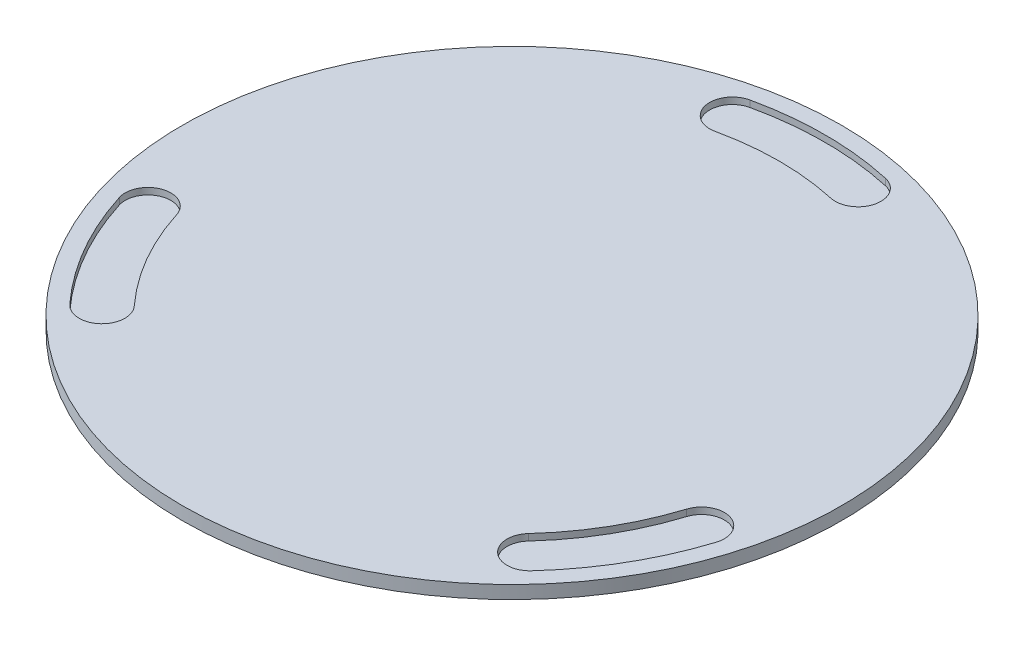
ISO-10303-21;
HEADER;
FILE_DESCRIPTION(('STEP AP214'),'2;1');
FILE_NAME('part.step','',(''),(''),'','','');
FILE_SCHEMA(('AUTOMOTIVE_DESIGN { 1 0 10303 214 1 1 1 1 }'));
ENDSEC;
DATA;
#1=APPLICATION_CONTEXT('core data for automotive mechanical design processes');
#2=APPLICATION_PROTOCOL_DEFINITION('international standard','automotive_design',2000,#1);
#3=PRODUCT_CONTEXT('',#1,'mechanical');
#4=PRODUCT('Part','Part','',(#3));
#5=PRODUCT_RELATED_PRODUCT_CATEGORY('part','',(#4));
#6=PRODUCT_DEFINITION_FORMATION('','',#4);
#7=PRODUCT_DEFINITION_CONTEXT('part definition',#1,'design');
#8=PRODUCT_DEFINITION('design','',#6,#7);
#9=PRODUCT_DEFINITION_SHAPE('','',#8);
#10=(LENGTH_UNIT() NAMED_UNIT(*) SI_UNIT(.MILLI.,.METRE.));
#11=(NAMED_UNIT(*) PLANE_ANGLE_UNIT() SI_UNIT($,.RADIAN.));
#12=(NAMED_UNIT(*) SI_UNIT($,.STERADIAN.) SOLID_ANGLE_UNIT());
#13=UNCERTAINTY_MEASURE_WITH_UNIT(LENGTH_MEASURE(1.E-05),#10,'distance_accuracy_value','');
#14=(GEOMETRIC_REPRESENTATION_CONTEXT(3) GLOBAL_UNCERTAINTY_ASSIGNED_CONTEXT((#13)) GLOBAL_UNIT_ASSIGNED_CONTEXT((#10,
#11,#12)) REPRESENTATION_CONTEXT('',''));
#15=CARTESIAN_POINT('',(0.,0.,0.));
#16=DIRECTION('',(0.,0.,1.));
#17=DIRECTION('',(1.,0.,0.));
#18=AXIS2_PLACEMENT_3D('',#15,#16,#17);
#19=CARTESIAN_POINT('',(0.,1.,0.));
#20=DIRECTION('',(0.,-1.,0.));
#21=DIRECTION('',(0.,0.,-1.));
#22=AXIS2_PLACEMENT_3D('',#19,#20,#21);
#23=CYLINDRICAL_SURFACE('',#22,50.5);
#24=CARTESIAN_POINT('',(0.,1.,0.));
#25=DIRECTION('',(0.,1.,0.));
#26=DIRECTION('',(0.,0.,1.));
#27=AXIS2_PLACEMENT_3D('',#24,#25,#26);
#28=CIRCLE('',#27,50.5);
#29=CARTESIAN_POINT('',(0.,1.,50.5));
#30=VERTEX_POINT('',#29);
#31=EDGE_CURVE('E11',#30,#30,#28,.T.);
#32=ORIENTED_EDGE('',*,*,#31,.F.);
#33=EDGE_LOOP('',(#32));
#34=FACE_BOUND('',#33,.T.);
#35=CARTESIAN_POINT('',(0.,-1.,0.));
#36=DIRECTION('',(0.,1.,0.));
#37=DIRECTION('',(0.,0.,1.));
#38=AXIS2_PLACEMENT_3D('',#35,#36,#37);
#39=CIRCLE('',#38,50.5);
#40=CARTESIAN_POINT('',(0.,-1.,50.5));
#41=VERTEX_POINT('',#40);
#42=EDGE_CURVE('E42',#41,#41,#39,.T.);
#43=ORIENTED_EDGE('',*,*,#42,.T.);
#44=EDGE_LOOP('',(#43));
#45=FACE_BOUND('',#44,.T.);
#46=ADVANCED_FACE('F39',(#34,#45),#23,.T.);
#47=CARTESIAN_POINT('',(0.,1.,0.));
#48=DIRECTION('',(0.,1.,0.));
#49=DIRECTION('',(0.,0.,1.));
#50=AXIS2_PLACEMENT_3D('',#47,#48,#49);
#51=PLANE('',#50);
#52=CARTESIAN_POINT('',(-42.4065150160027,1.,13.3707228251244));
#53=DIRECTION('',(0.,1.,0.));
#54=DIRECTION('',(0.866025403784436,0.,-0.500000000000004));
#55=AXIS2_PLACEMENT_3D('',#52,#53,#54);
#56=CIRCLE('',#55,3.5);
#57=CARTESIAN_POINT('',(-39.0685056883839,1.,12.3182525268594));
#58=VERTEX_POINT('',#57);
#59=CARTESIAN_POINT('',(-45.7445243436214,1.,14.4231931233894));
#60=VERTEX_POINT('',#59);
#61=EDGE_CURVE('E54',#58,#60,#56,.T.);
#62=ORIENTED_EDGE('',*,*,#61,.F.);
#63=CARTESIAN_POINT('',(0.,1.,0.));
#64=DIRECTION('',(0.,-1.,0.));
#65=DIRECTION('',(0.866025403784436,0.,-0.500000000000004));
#66=AXIS2_PLACEMENT_3D('',#63,#64,#65);
#67=CIRCLE('',#66,40.96446609);
#68=CARTESIAN_POINT('',(-30.2021724626838,1.,27.6751921506078));
#69=VERTEX_POINT('',#68);
#70=EDGE_CURVE('E151',#69,#58,#67,.T.);
#71=ORIENTED_EDGE('',*,*,#70,.F.);
#72=CARTESIAN_POINT('',(-32.7826431415192,1.,30.0397578772627));
#73=DIRECTION('',(0.,1.,0.));
#74=DIRECTION('',(0.866025403784436,0.,-0.500000000000004));
#75=AXIS2_PLACEMENT_3D('',#72,#73,#74);
#76=CIRCLE('',#75,3.5);
#77=CARTESIAN_POINT('',(-35.3631138203547,1.,32.4043236039175));
#78=VERTEX_POINT('',#77);
#79=EDGE_CURVE('E155',#78,#69,#76,.T.);
#80=ORIENTED_EDGE('',*,*,#79,.F.);
#81=CARTESIAN_POINT('',(0.,1.,0.));
#82=DIRECTION('',(0.,1.,0.));
#83=DIRECTION('',(0.866025403784436,0.,-0.500000000000004));
#84=AXIS2_PLACEMENT_3D('',#81,#82,#83);
#85=CIRCLE('',#84,47.96446609);
#86=EDGE_CURVE('E164',#60,#78,#85,.T.);
#87=ORIENTED_EDGE('',*,*,#86,.F.);
#88=EDGE_LOOP('',(#62,#71,#80,#87));
#89=FACE_BOUND('',#88,.T.);
#90=CARTESIAN_POINT('',(32.7826431415196,1.,30.0397578772622));
#91=DIRECTION('',(0.,1.,0.));
#92=DIRECTION('',(-0.866025403784443,0.,-0.499999999999992));
#93=AXIS2_PLACEMENT_3D('',#90,#91,#92);
#94=CIRCLE('',#93,3.5);
#95=CARTESIAN_POINT('',(30.2021724626842,1.,27.6751921506074));
#96=VERTEX_POINT('',#95);
#97=CARTESIAN_POINT('',(35.3631138203551,1.,32.404323603917));
#98=VERTEX_POINT('',#97);
#99=EDGE_CURVE('E62',#96,#98,#94,.T.);
#100=ORIENTED_EDGE('',*,*,#99,.F.);
#101=CARTESIAN_POINT('',(0.,1.,0.));
#102=DIRECTION('',(0.,-1.,0.));
#103=DIRECTION('',(-0.866025403784443,0.,-0.499999999999992));
#104=AXIS2_PLACEMENT_3D('',#101,#102,#103);
#105=CIRCLE('',#104,40.96446609);
#106=CARTESIAN_POINT('',(39.068505688384,1.,12.3182525268589));
#107=VERTEX_POINT('',#106);
#108=EDGE_CURVE('E185',#107,#96,#105,.T.);
#109=ORIENTED_EDGE('',*,*,#108,.F.);
#110=CARTESIAN_POINT('',(42.4065150160028,1.,13.3707228251238));
#111=DIRECTION('',(0.,1.,0.));
#112=DIRECTION('',(-0.866025403784443,0.,-0.499999999999992));
#113=AXIS2_PLACEMENT_3D('',#110,#111,#112);
#114=CIRCLE('',#113,3.5);
#115=CARTESIAN_POINT('',(45.7445243436216,1.,14.4231931233888));
#116=VERTEX_POINT('',#115);
#117=EDGE_CURVE('E204',#116,#107,#114,.T.);
#118=ORIENTED_EDGE('',*,*,#117,.F.);
#119=CARTESIAN_POINT('',(0.,1.,0.));
#120=DIRECTION('',(0.,1.,0.));
#121=DIRECTION('',(-0.866025403784443,0.,-0.499999999999992));
#122=AXIS2_PLACEMENT_3D('',#119,#120,#121);
#123=CIRCLE('',#122,47.96446609);
#124=EDGE_CURVE('E200',#98,#116,#123,.T.);
#125=ORIENTED_EDGE('',*,*,#124,.F.);
#126=EDGE_LOOP('',(#100,#109,#118,#125));
#127=FACE_BOUND('',#126,.T.);
#128=CARTESIAN_POINT('',(9.62387187448334,1.,-43.4104807023867));
#129=DIRECTION('',(0.,1.,0.));
#130=DIRECTION('',(0.,0.,1.));
#131=AXIS2_PLACEMENT_3D('',#128,#129,#130);
#132=CIRCLE('',#131,3.5);
#133=CARTESIAN_POINT('',(8.8663332257,1.,-39.9934446774669));
#134=VERTEX_POINT('',#133);
#135=CARTESIAN_POINT('',(10.3814105232667,1.,-46.8275167273065));
#136=VERTEX_POINT('',#135);
#137=EDGE_CURVE('E174',#134,#136,#132,.T.);
#138=ORIENTED_EDGE('',*,*,#137,.F.);
#139=CARTESIAN_POINT('',(0.,1.,0.));
#140=DIRECTION('',(0.,-1.,0.));
#141=DIRECTION('',(0.,0.,1.));
#142=AXIS2_PLACEMENT_3D('',#139,#140,#141);
#143=CIRCLE('',#142,40.96446609);
#144=CARTESIAN_POINT('',(-8.86633322569999,1.,-39.9934446774669));
#145=VERTEX_POINT('',#144);
#146=EDGE_CURVE('E226',#145,#134,#143,.T.);
#147=ORIENTED_EDGE('',*,*,#146,.F.);
#148=CARTESIAN_POINT('',(-9.62387187448334,1.,-43.4104807023867));
#149=DIRECTION('',(0.,1.,0.));
#150=DIRECTION('',(0.,0.,1.));
#151=AXIS2_PLACEMENT_3D('',#148,#149,#150);
#152=CIRCLE('',#151,3.5);
#153=CARTESIAN_POINT('',(-10.3814105232667,1.,-46.8275167273065));
#154=VERTEX_POINT('',#153);
#155=EDGE_CURVE('E245',#154,#145,#152,.T.);
#156=ORIENTED_EDGE('',*,*,#155,.F.);
#157=CARTESIAN_POINT('',(0.,1.,0.));
#158=DIRECTION('',(0.,1.,0.));
#159=DIRECTION('',(0.,0.,1.));
#160=AXIS2_PLACEMENT_3D('',#157,#158,#159);
#161=CIRCLE('',#160,47.96446609);
#162=EDGE_CURVE('E241',#136,#154,#161,.T.);
#163=ORIENTED_EDGE('',*,*,#162,.F.);
#164=EDGE_LOOP('',(#138,#147,#156,#163));
#165=FACE_BOUND('',#164,.T.);
#166=ORIENTED_EDGE('',*,*,#31,.T.);
#167=EDGE_LOOP('',(#166));
#168=FACE_BOUND('',#167,.T.);
#169=ADVANCED_FACE('F272',(#89,#127,#165,#168),#51,.T.);
#170=CARTESIAN_POINT('',(0.,-1.,0.));
#171=DIRECTION('',(0.,1.,0.));
#172=DIRECTION('',(0.,0.,1.));
#173=AXIS2_PLACEMENT_3D('',#170,#171,#172);
#174=PLANE('',#173);
#175=ORIENTED_EDGE('',*,*,#42,.F.);
#176=EDGE_LOOP('',(#175));
#177=FACE_BOUND('',#176,.T.);
#178=ADVANCED_FACE('F291',(#177),#174,.F.);
#179=CARTESIAN_POINT('',(9.62387187448334,0.,-43.4104807023867));
#180=DIRECTION('',(0.,1.,0.));
#181=DIRECTION('',(0.,0.,1.));
#182=AXIS2_PLACEMENT_3D('',#179,#180,#181);
#183=CYLINDRICAL_SURFACE('',#182,3.5);
#184=ORIENTED_EDGE('',*,*,#137,.T.);
#185=DIRECTION('',(0.,1.,0.));
#186=VECTOR('',#185,1.);
#187=CARTESIAN_POINT('',(10.3814105232667,0.,-46.8275167273065));
#188=LINE('',#187,#186);
#189=CARTESIAN_POINT('',(10.3814105232667,0.,-46.8275167273065));
#190=VERTEX_POINT('',#189);
#191=EDGE_CURVE('E238',#190,#136,#188,.T.);
#192=ORIENTED_EDGE('',*,*,#191,.F.);
#193=CARTESIAN_POINT('',(9.62387187448334,0.,-43.4104807023867));
#194=DIRECTION('',(0.,1.,0.));
#195=DIRECTION('',(0.,0.,1.));
#196=AXIS2_PLACEMENT_3D('',#193,#194,#195);
#197=CIRCLE('',#196,3.5);
#198=CARTESIAN_POINT('',(8.8663332257,0.,-39.9934446774669));
#199=VERTEX_POINT('',#198);
#200=EDGE_CURVE('E221',#199,#190,#197,.T.);
#201=ORIENTED_EDGE('',*,*,#200,.F.);
#202=DIRECTION('',(0.,1.,0.));
#203=VECTOR('',#202,1.);
#204=CARTESIAN_POINT('',(8.8663332257,0.,-39.9934446774669));
#205=LINE('',#204,#203);
#206=EDGE_CURVE('E252',#199,#134,#205,.T.);
#207=ORIENTED_EDGE('',*,*,#206,.T.);
#208=EDGE_LOOP('',(#184,#192,#201,#207));
#209=FACE_BOUND('',#208,.T.);
#210=ADVANCED_FACE('F281',(#209),#183,.F.);
#211=CARTESIAN_POINT('',(0.,0.,0.));
#212=DIRECTION('',(0.,1.,0.));
#213=DIRECTION('',(0.,0.,1.));
#214=AXIS2_PLACEMENT_3D('',#211,#212,#213);
#215=CYLINDRICAL_SURFACE('',#214,40.96446609);
#216=ORIENTED_EDGE('',*,*,#146,.T.);
#217=ORIENTED_EDGE('',*,*,#206,.F.);
#218=CARTESIAN_POINT('',(0.,0.,0.));
#219=DIRECTION('',(0.,-1.,0.));
#220=DIRECTION('',(0.,0.,1.));
#221=AXIS2_PLACEMENT_3D('',#218,#219,#220);
#222=CIRCLE('',#221,40.96446609);
#223=CARTESIAN_POINT('',(-8.86633322569999,0.,-39.9934446774669));
#224=VERTEX_POINT('',#223);
#225=EDGE_CURVE('E234',#224,#199,#222,.T.);
#226=ORIENTED_EDGE('',*,*,#225,.F.);
#227=DIRECTION('',(0.,1.,0.));
#228=VECTOR('',#227,1.);
#229=CARTESIAN_POINT('',(-8.86633322569999,0.,-39.9934446774669));
#230=LINE('',#229,#228);
#231=EDGE_CURVE('E255',#224,#145,#230,.T.);
#232=ORIENTED_EDGE('',*,*,#231,.T.);
#233=EDGE_LOOP('',(#216,#217,#226,#232));
#234=FACE_BOUND('',#233,.T.);
#235=ADVANCED_FACE('F283',(#234),#215,.T.);
#236=CARTESIAN_POINT('',(-9.62387187448334,0.,-43.4104807023867));
#237=DIRECTION('',(0.,1.,0.));
#238=DIRECTION('',(0.,0.,1.));
#239=AXIS2_PLACEMENT_3D('',#236,#237,#238);
#240=CYLINDRICAL_SURFACE('',#239,3.5);
#241=ORIENTED_EDGE('',*,*,#155,.T.);
#242=ORIENTED_EDGE('',*,*,#231,.F.);
#243=CARTESIAN_POINT('',(-9.62387187448334,0.,-43.4104807023867));
#244=DIRECTION('',(0.,1.,0.));
#245=DIRECTION('',(0.,0.,1.));
#246=AXIS2_PLACEMENT_3D('',#243,#244,#245);
#247=CIRCLE('',#246,3.5);
#248=CARTESIAN_POINT('',(-10.3814105232667,0.,-46.8275167273065));
#249=VERTEX_POINT('',#248);
#250=EDGE_CURVE('E230',#249,#224,#247,.T.);
#251=ORIENTED_EDGE('',*,*,#250,.F.);
#252=DIRECTION('',(0.,1.,0.));
#253=VECTOR('',#252,1.);
#254=CARTESIAN_POINT('',(-10.3814105232667,0.,-46.8275167273065));
#255=LINE('',#254,#253);
#256=EDGE_CURVE('E258',#249,#154,#255,.T.);
#257=ORIENTED_EDGE('',*,*,#256,.T.);
#258=EDGE_LOOP('',(#241,#242,#251,#257));
#259=FACE_BOUND('',#258,.T.);
#260=ADVANCED_FACE('F276',(#259),#240,.F.);
#261=CARTESIAN_POINT('',(0.,0.,0.));
#262=DIRECTION('',(0.,1.,0.));
#263=DIRECTION('',(0.,0.,1.));
#264=AXIS2_PLACEMENT_3D('',#261,#262,#263);
#265=CYLINDRICAL_SURFACE('',#264,47.96446609);
#266=ORIENTED_EDGE('',*,*,#162,.T.);
#267=ORIENTED_EDGE('',*,*,#256,.F.);
#268=CARTESIAN_POINT('',(0.,0.,0.));
#269=DIRECTION('',(0.,1.,0.));
#270=DIRECTION('',(0.,0.,1.));
#271=AXIS2_PLACEMENT_3D('',#268,#269,#270);
#272=CIRCLE('',#271,47.96446609);
#273=EDGE_CURVE('E225',#190,#249,#272,.T.);
#274=ORIENTED_EDGE('',*,*,#273,.F.);
#275=ORIENTED_EDGE('',*,*,#191,.T.);
#276=EDGE_LOOP('',(#266,#267,#274,#275));
#277=FACE_BOUND('',#276,.T.);
#278=ADVANCED_FACE('F266',(#277),#265,.F.);
#279=CARTESIAN_POINT('',(4.81193593724167,0.,-21.7052403511934));
#280=DIRECTION('',(0.,1.,0.));
#281=DIRECTION('',(0.,0.,1.));
#282=AXIS2_PLACEMENT_3D('',#279,#280,#281);
#283=PLANE('',#282);
#284=ORIENTED_EDGE('',*,*,#200,.T.);
#285=ORIENTED_EDGE('',*,*,#273,.T.);
#286=ORIENTED_EDGE('',*,*,#250,.T.);
#287=ORIENTED_EDGE('',*,*,#225,.T.);
#288=EDGE_LOOP('',(#284,#285,#286,#287));
#289=FACE_BOUND('',#288,.T.);
#290=ADVANCED_FACE('F280',(#289),#283,.T.);
#291=CARTESIAN_POINT('',(32.7826431415196,0.,30.0397578772622));
#292=DIRECTION('',(0.,1.,0.));
#293=DIRECTION('',(0.,0.,1.));
#294=AXIS2_PLACEMENT_3D('',#291,#292,#293);
#295=CYLINDRICAL_SURFACE('',#294,3.5);
#296=ORIENTED_EDGE('',*,*,#99,.T.);
#297=DIRECTION('',(0.,1.,0.));
#298=VECTOR('',#297,1.);
#299=CARTESIAN_POINT('',(35.3631138203551,0.,32.404323603917));
#300=LINE('',#299,#298);
#301=CARTESIAN_POINT('',(35.3631138203551,0.,32.404323603917));
#302=VERTEX_POINT('',#301);
#303=EDGE_CURVE('E197',#302,#98,#300,.T.);
#304=ORIENTED_EDGE('',*,*,#303,.F.);
#305=CARTESIAN_POINT('',(32.7826431415196,0.,30.0397578772622));
#306=DIRECTION('',(0.,1.,0.));
#307=DIRECTION('',(-0.866025403784443,0.,-0.499999999999992));
#308=AXIS2_PLACEMENT_3D('',#305,#306,#307);
#309=CIRCLE('',#308,3.5);
#310=CARTESIAN_POINT('',(30.2021724626842,0.,27.6751921506074));
#311=VERTEX_POINT('',#310);
#312=EDGE_CURVE('E180',#311,#302,#309,.T.);
#313=ORIENTED_EDGE('',*,*,#312,.F.);
#314=DIRECTION('',(0.,1.,0.));
#315=VECTOR('',#314,1.);
#316=CARTESIAN_POINT('',(30.2021724626842,0.,27.6751921506074));
#317=LINE('',#316,#315);
#318=EDGE_CURVE('E165',#311,#96,#317,.T.);
#319=ORIENTED_EDGE('',*,*,#318,.T.);
#320=EDGE_LOOP('',(#296,#304,#313,#319));
#321=FACE_BOUND('',#320,.T.);
#322=ADVANCED_FACE('F315',(#321),#295,.F.);
#323=CARTESIAN_POINT('',(0.,0.,0.));
#324=DIRECTION('',(0.,1.,0.));
#325=DIRECTION('',(0.,0.,1.));
#326=AXIS2_PLACEMENT_3D('',#323,#324,#325);
#327=CYLINDRICAL_SURFACE('',#326,40.96446609);
#328=ORIENTED_EDGE('',*,*,#108,.T.);
#329=ORIENTED_EDGE('',*,*,#318,.F.);
#330=CARTESIAN_POINT('',(0.,0.,0.));
#331=DIRECTION('',(0.,-1.,0.));
#332=DIRECTION('',(-0.866025403784443,0.,-0.499999999999992));
#333=AXIS2_PLACEMENT_3D('',#330,#331,#332);
#334=CIRCLE('',#333,40.96446609);
#335=CARTESIAN_POINT('',(39.068505688384,0.,12.3182525268589));
#336=VERTEX_POINT('',#335);
#337=EDGE_CURVE('E193',#336,#311,#334,.T.);
#338=ORIENTED_EDGE('',*,*,#337,.F.);
#339=DIRECTION('',(0.,1.,0.));
#340=VECTOR('',#339,1.);
#341=CARTESIAN_POINT('',(39.068505688384,0.,12.3182525268589));
#342=LINE('',#341,#340);
#343=EDGE_CURVE('E213',#336,#107,#342,.T.);
#344=ORIENTED_EDGE('',*,*,#343,.T.);
#345=EDGE_LOOP('',(#328,#329,#338,#344));
#346=FACE_BOUND('',#345,.T.);
#347=ADVANCED_FACE('F319',(#346),#327,.T.);
#348=CARTESIAN_POINT('',(42.4065150160028,0.,13.3707228251238));
#349=DIRECTION('',(0.,1.,0.));
#350=DIRECTION('',(0.,0.,1.));
#351=AXIS2_PLACEMENT_3D('',#348,#349,#350);
#352=CYLINDRICAL_SURFACE('',#351,3.5);
#353=ORIENTED_EDGE('',*,*,#117,.T.);
#354=ORIENTED_EDGE('',*,*,#343,.F.);
#355=CARTESIAN_POINT('',(42.4065150160028,0.,13.3707228251238));
#356=DIRECTION('',(0.,1.,0.));
#357=DIRECTION('',(-0.866025403784443,0.,-0.499999999999992));
#358=AXIS2_PLACEMENT_3D('',#355,#356,#357);
#359=CIRCLE('',#358,3.5);
#360=CARTESIAN_POINT('',(45.7445243436216,0.,14.4231931233888));
#361=VERTEX_POINT('',#360);
#362=EDGE_CURVE('E189',#361,#336,#359,.T.);
#363=ORIENTED_EDGE('',*,*,#362,.F.);
#364=DIRECTION('',(0.,1.,0.));
#365=VECTOR('',#364,1.);
#366=CARTESIAN_POINT('',(45.7445243436216,0.,14.4231931233888));
#367=LINE('',#366,#365);
#368=EDGE_CURVE('E216',#361,#116,#367,.T.);
#369=ORIENTED_EDGE('',*,*,#368,.T.);
#370=EDGE_LOOP('',(#353,#354,#363,#369));
#371=FACE_BOUND('',#370,.T.);
#372=ADVANCED_FACE('F326',(#371),#352,.F.);
#373=CARTESIAN_POINT('',(0.,0.,0.));
#374=DIRECTION('',(0.,1.,0.));
#375=DIRECTION('',(0.,0.,1.));
#376=AXIS2_PLACEMENT_3D('',#373,#374,#375);
#377=CYLINDRICAL_SURFACE('',#376,47.96446609);
#378=ORIENTED_EDGE('',*,*,#124,.T.);
#379=ORIENTED_EDGE('',*,*,#368,.F.);
#380=CARTESIAN_POINT('',(0.,0.,0.));
#381=DIRECTION('',(0.,1.,0.));
#382=DIRECTION('',(-0.866025403784443,0.,-0.499999999999992));
#383=AXIS2_PLACEMENT_3D('',#380,#381,#382);
#384=CIRCLE('',#383,47.96446609);
#385=EDGE_CURVE('E184',#302,#361,#384,.T.);
#386=ORIENTED_EDGE('',*,*,#385,.F.);
#387=ORIENTED_EDGE('',*,*,#303,.T.);
#388=EDGE_LOOP('',(#378,#379,#386,#387));
#389=FACE_BOUND('',#388,.T.);
#390=ADVANCED_FACE('F322',(#389),#377,.F.);
#391=CARTESIAN_POINT('',(16.3913215707598,0.,15.0198789386311));
#392=DIRECTION('',(0.,1.,0.));
#393=DIRECTION('',(-0.866025403784443,0.,-0.499999999999992));
#394=AXIS2_PLACEMENT_3D('',#391,#392,#393);
#395=PLANE('',#394);
#396=ORIENTED_EDGE('',*,*,#312,.T.);
#397=ORIENTED_EDGE('',*,*,#385,.T.);
#398=ORIENTED_EDGE('',*,*,#362,.T.);
#399=ORIENTED_EDGE('',*,*,#337,.T.);
#400=EDGE_LOOP('',(#396,#397,#398,#399));
#401=FACE_BOUND('',#400,.T.);
#402=ADVANCED_FACE('F325',(#401),#395,.T.);
#403=CARTESIAN_POINT('',(-42.4065150160027,0.,13.3707228251244));
#404=DIRECTION('',(0.,1.,0.));
#405=DIRECTION('',(0.,0.,1.));
#406=AXIS2_PLACEMENT_3D('',#403,#404,#405);
#407=CYLINDRICAL_SURFACE('',#406,3.5);
#408=ORIENTED_EDGE('',*,*,#61,.T.);
#409=DIRECTION('',(0.,1.,0.));
#410=VECTOR('',#409,1.);
#411=CARTESIAN_POINT('',(-45.7445243436214,0.,14.4231931233894));
#412=LINE('',#411,#410);
#413=CARTESIAN_POINT('',(-45.7445243436214,0.,14.4231931233894));
#414=VERTEX_POINT('',#413);
#415=EDGE_CURVE('E126',#414,#60,#412,.T.);
#416=ORIENTED_EDGE('',*,*,#415,.F.);
#417=CARTESIAN_POINT('',(-42.4065150160027,0.,13.3707228251244));
#418=DIRECTION('',(0.,1.,0.));
#419=DIRECTION('',(0.866025403784436,0.,-0.500000000000004));
#420=AXIS2_PLACEMENT_3D('',#417,#418,#419);
#421=CIRCLE('',#420,3.5);
#422=CARTESIAN_POINT('',(-39.0685056883839,0.,12.3182525268594));
#423=VERTEX_POINT('',#422);
#424=EDGE_CURVE('E130',#423,#414,#421,.T.);
#425=ORIENTED_EDGE('',*,*,#424,.F.);
#426=DIRECTION('',(0.,1.,0.));
#427=VECTOR('',#426,1.);
#428=CARTESIAN_POINT('',(-39.0685056883839,0.,12.3182525268594));
#429=LINE('',#428,#427);
#430=EDGE_CURVE('E171',#423,#58,#429,.T.);
#431=ORIENTED_EDGE('',*,*,#430,.T.);
#432=EDGE_LOOP('',(#408,#416,#425,#431));
#433=FACE_BOUND('',#432,.T.);
#434=ADVANCED_FACE('F128',(#433),#407,.F.);
#435=CARTESIAN_POINT('',(0.,0.,0.));
#436=DIRECTION('',(0.,1.,0.));
#437=DIRECTION('',(0.,0.,1.));
#438=AXIS2_PLACEMENT_3D('',#435,#436,#437);
#439=CYLINDRICAL_SURFACE('',#438,40.96446609);
#440=ORIENTED_EDGE('',*,*,#70,.T.);
#441=ORIENTED_EDGE('',*,*,#430,.F.);
#442=CARTESIAN_POINT('',(0.,0.,0.));
#443=DIRECTION('',(0.,-1.,0.));
#444=DIRECTION('',(0.866025403784436,0.,-0.500000000000004));
#445=AXIS2_PLACEMENT_3D('',#442,#443,#444);
#446=CIRCLE('',#445,40.96446609);
#447=CARTESIAN_POINT('',(-30.2021724626838,0.,27.6751921506078));
#448=VERTEX_POINT('',#447);
#449=EDGE_CURVE('E137',#448,#423,#446,.T.);
#450=ORIENTED_EDGE('',*,*,#449,.F.);
#451=DIRECTION('',(0.,1.,0.));
#452=VECTOR('',#451,1.);
#453=CARTESIAN_POINT('',(-30.2021724626838,0.,27.6751921506078));
#454=LINE('',#453,#452);
#455=EDGE_CURVE('E175',#448,#69,#454,.T.);
#456=ORIENTED_EDGE('',*,*,#455,.T.);
#457=EDGE_LOOP('',(#440,#441,#450,#456));
#458=FACE_BOUND('',#457,.T.);
#459=ADVANCED_FACE('F339',(#458),#439,.T.);
#460=CARTESIAN_POINT('',(-32.7826431415192,0.,30.0397578772627));
#461=DIRECTION('',(0.,1.,0.));
#462=DIRECTION('',(0.,0.,1.));
#463=AXIS2_PLACEMENT_3D('',#460,#461,#462);
#464=CYLINDRICAL_SURFACE('',#463,3.5);
#465=ORIENTED_EDGE('',*,*,#79,.T.);
#466=ORIENTED_EDGE('',*,*,#455,.F.);
#467=CARTESIAN_POINT('',(-32.7826431415192,0.,30.0397578772627));
#468=DIRECTION('',(0.,1.,0.));
#469=DIRECTION('',(0.866025403784436,0.,-0.500000000000004));
#470=AXIS2_PLACEMENT_3D('',#467,#468,#469);
#471=CIRCLE('',#470,3.5);
#472=CARTESIAN_POINT('',(-35.3631138203547,0.,32.4043236039175));
#473=VERTEX_POINT('',#472);
#474=EDGE_CURVE('E146',#473,#448,#471,.T.);
#475=ORIENTED_EDGE('',*,*,#474,.F.);
#476=DIRECTION('',(0.,1.,0.));
#477=VECTOR('',#476,1.);
#478=CARTESIAN_POINT('',(-35.3631138203547,0.,32.4043236039175));
#479=LINE('',#478,#477);
#480=EDGE_CURVE('E136',#473,#78,#479,.T.);
#481=ORIENTED_EDGE('',*,*,#480,.T.);
#482=EDGE_LOOP('',(#465,#466,#475,#481));
#483=FACE_BOUND('',#482,.T.);
#484=ADVANCED_FACE('F342',(#483),#464,.F.);
#485=CARTESIAN_POINT('',(0.,0.,0.));
#486=DIRECTION('',(0.,1.,0.));
#487=DIRECTION('',(0.,0.,1.));
#488=AXIS2_PLACEMENT_3D('',#485,#486,#487);
#489=CYLINDRICAL_SURFACE('',#488,47.96446609);
#490=ORIENTED_EDGE('',*,*,#86,.T.);
#491=ORIENTED_EDGE('',*,*,#480,.F.);
#492=CARTESIAN_POINT('',(0.,0.,0.));
#493=DIRECTION('',(0.,1.,0.));
#494=DIRECTION('',(0.866025403784436,0.,-0.500000000000004));
#495=AXIS2_PLACEMENT_3D('',#492,#493,#494);
#496=CIRCLE('',#495,47.96446609);
#497=EDGE_CURVE('E140',#414,#473,#496,.T.);
#498=ORIENTED_EDGE('',*,*,#497,.F.);
#499=ORIENTED_EDGE('',*,*,#415,.T.);
#500=EDGE_LOOP('',(#490,#491,#498,#499));
#501=FACE_BOUND('',#500,.T.);
#502=ADVANCED_FACE('F141',(#501),#489,.F.);
#503=CARTESIAN_POINT('',(-21.2032575080013,0.,6.68536141256221));
#504=DIRECTION('',(0.,1.,0.));
#505=DIRECTION('',(0.866025403784436,0.,-0.500000000000004));
#506=AXIS2_PLACEMENT_3D('',#503,#504,#505);
#507=PLANE('',#506);
#508=ORIENTED_EDGE('',*,*,#424,.T.);
#509=ORIENTED_EDGE('',*,*,#497,.T.);
#510=ORIENTED_EDGE('',*,*,#474,.T.);
#511=ORIENTED_EDGE('',*,*,#449,.T.);
#512=EDGE_LOOP('',(#508,#509,#510,#511));
#513=FACE_BOUND('',#512,.T.);
#514=ADVANCED_FACE('F148',(#513),#507,.T.);
#515=CLOSED_SHELL('',(#46,#169,#178,#210,#235,#260,#278,#290,#322,#347,#372,#390,#402,#434,#459,
#484,#502,#514));
#516=MANIFOLD_SOLID_BREP('B2',#515);
#517=ADVANCED_BREP_SHAPE_REPRESENTATION('',(#18,#516),#14);
#518=SHAPE_DEFINITION_REPRESENTATION(#9,#517);
ENDSEC;
END-ISO-10303-21;
